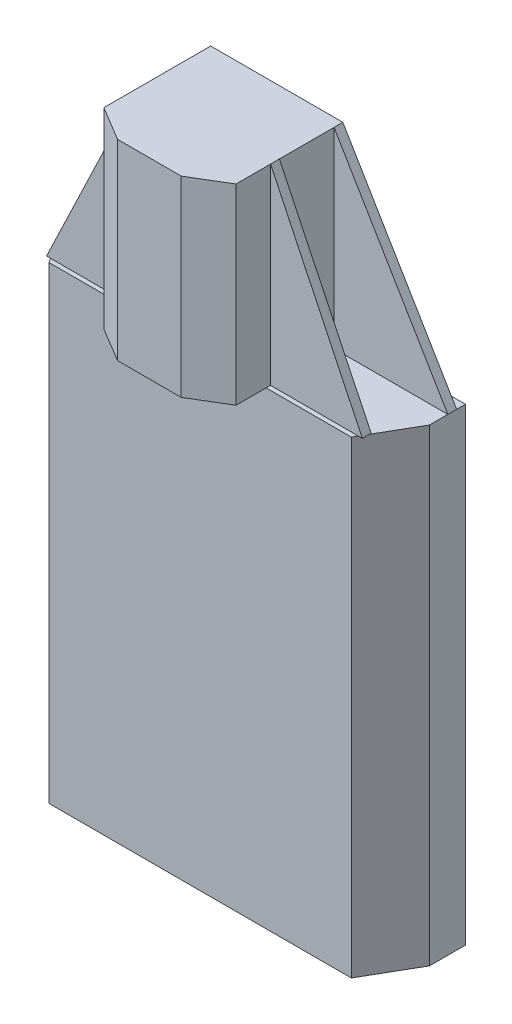
ISO-10303-21;
HEADER;
FILE_DESCRIPTION(('STEP AP214'),'2;1');
FILE_NAME('part.step','',(''),(''),'','','');
FILE_SCHEMA(('AUTOMOTIVE_DESIGN { 1 0 10303 214 1 1 1 1 }'));
ENDSEC;
DATA;
#1=APPLICATION_CONTEXT('core data for automotive mechanical design processes');
#2=APPLICATION_PROTOCOL_DEFINITION('international standard','automotive_design',2000,#1);
#3=PRODUCT_CONTEXT('',#1,'mechanical');
#4=PRODUCT('Part','Part','',(#3));
#5=PRODUCT_RELATED_PRODUCT_CATEGORY('part','',(#4));
#6=PRODUCT_DEFINITION_FORMATION('','',#4);
#7=PRODUCT_DEFINITION_CONTEXT('part definition',#1,'design');
#8=PRODUCT_DEFINITION('design','',#6,#7);
#9=PRODUCT_DEFINITION_SHAPE('','',#8);
#10=(LENGTH_UNIT() NAMED_UNIT(*) SI_UNIT(.MILLI.,.METRE.));
#11=(NAMED_UNIT(*) PLANE_ANGLE_UNIT() SI_UNIT($,.RADIAN.));
#12=(NAMED_UNIT(*) SI_UNIT($,.STERADIAN.) SOLID_ANGLE_UNIT());
#13=UNCERTAINTY_MEASURE_WITH_UNIT(LENGTH_MEASURE(1.E-05),#10,'distance_accuracy_value','');
#14=(GEOMETRIC_REPRESENTATION_CONTEXT(3) GLOBAL_UNCERTAINTY_ASSIGNED_CONTEXT((#13)) GLOBAL_UNIT_ASSIGNED_CONTEXT((#10,
#11,#12)) REPRESENTATION_CONTEXT('',''));
#15=CARTESIAN_POINT('',(0.,0.,0.));
#16=DIRECTION('',(0.,0.,1.));
#17=DIRECTION('',(1.,0.,0.));
#18=AXIS2_PLACEMENT_3D('',#15,#16,#17);
#19=CARTESIAN_POINT('',(-50.,-54.,1277.));
#20=DIRECTION('',(0.,-1.,0.));
#21=DIRECTION('',(1.,0.,0.));
#22=AXIS2_PLACEMENT_3D('',#19,#20,#21);
#23=PLANE('',#22);
#24=DIRECTION('',(0.,0.,1.));
#25=VECTOR('',#24,1.);
#26=CARTESIAN_POINT('',(195.,-54.,1277.));
#27=LINE('',#26,#25);
#28=CARTESIAN_POINT('',(195.,-54.,1277.));
#29=VERTEX_POINT('',#28);
#30=CARTESIAN_POINT('',(195.,-54.,1326.));
#31=VERTEX_POINT('',#30);
#32=EDGE_CURVE('E11',#29,#31,#27,.T.);
#33=ORIENTED_EDGE('',*,*,#32,.T.);
#34=DIRECTION('',(-0.500000000000017,0.,0.866025403784429));
#35=VECTOR('',#34,1.);
#36=CARTESIAN_POINT('',(195.,-54.,1326.));
#37=LINE('',#36,#35);
#38=CARTESIAN_POINT('',(156.0288568297,-54.,1393.5));
#39=VERTEX_POINT('',#38);
#40=EDGE_CURVE('E27',#31,#39,#37,.T.);
#41=ORIENTED_EDGE('',*,*,#40,.T.);
#42=DIRECTION('',(-1.,0.,0.));
#43=VECTOR('',#42,1.);
#44=CARTESIAN_POINT('',(156.0288568297,-54.,1393.5));
#45=LINE('',#44,#43);
#46=CARTESIAN_POINT('',(-256.0288568297,-54.,1393.5));
#47=VERTEX_POINT('',#46);
#48=EDGE_CURVE('E347',#39,#47,#45,.T.);
#49=ORIENTED_EDGE('',*,*,#48,.T.);
#50=DIRECTION('',(-0.500000000000017,0.,-0.866025403784429));
#51=VECTOR('',#50,1.);
#52=CARTESIAN_POINT('',(-256.0288568297,-54.,1393.5));
#53=LINE('',#52,#51);
#54=CARTESIAN_POINT('',(-295.,-54.,1326.));
#55=VERTEX_POINT('',#54);
#56=EDGE_CURVE('E362',#47,#55,#53,.T.);
#57=ORIENTED_EDGE('',*,*,#56,.T.);
#58=DIRECTION('',(0.,0.,-1.));
#59=VECTOR('',#58,1.);
#60=CARTESIAN_POINT('',(-295.,-54.,1326.));
#61=LINE('',#60,#59);
#62=CARTESIAN_POINT('',(-295.,-54.,1277.));
#63=VERTEX_POINT('',#62);
#64=EDGE_CURVE('E369',#55,#63,#61,.T.);
#65=ORIENTED_EDGE('',*,*,#64,.T.);
#66=DIRECTION('',(1.,0.,0.));
#67=VECTOR('',#66,1.);
#68=CARTESIAN_POINT('',(-295.,-54.,1277.));
#69=LINE('',#68,#67);
#70=EDGE_CURVE('E285',#63,#29,#69,.T.);
#71=ORIENTED_EDGE('',*,*,#70,.T.);
#72=EDGE_LOOP('',(#33,#41,#49,#57,#65,#71));
#73=FACE_BOUND('',#72,.T.);
#74=ADVANCED_FACE('F17',(#73),#23,.T.);
#75=CARTESIAN_POINT('',(-295.,-54.,1277.));
#76=DIRECTION('',(0.,0.,-1.));
#77=DIRECTION('',(0.,1.,0.));
#78=AXIS2_PLACEMENT_3D('',#75,#76,#77);
#79=PLANE('',#78);
#80=DIRECTION('',(0.,1.,0.));
#81=VECTOR('',#80,1.);
#82=CARTESIAN_POINT('',(-295.,-54.,1277.));
#83=LINE('',#82,#81);
#84=CARTESIAN_POINT('',(-295.,584.,1277.));
#85=VERTEX_POINT('',#84);
#86=EDGE_CURVE('E175',#63,#85,#83,.T.);
#87=ORIENTED_EDGE('',*,*,#86,.T.);
#88=DIRECTION('',(1.,0.,0.));
#89=VECTOR('',#88,1.);
#90=CARTESIAN_POINT('',(-295.,584.,1277.));
#91=LINE('',#90,#89);
#92=CARTESIAN_POINT('',(195.,584.,1277.));
#93=VERTEX_POINT('',#92);
#94=EDGE_CURVE('E172',#85,#93,#91,.T.);
#95=ORIENTED_EDGE('',*,*,#94,.T.);
#96=DIRECTION('',(0.,1.,0.));
#97=VECTOR('',#96,1.);
#98=CARTESIAN_POINT('',(195.,-54.,1277.));
#99=LINE('',#98,#97);
#100=EDGE_CURVE('E160',#29,#93,#99,.T.);
#101=ORIENTED_EDGE('',*,*,#100,.F.);
#102=ORIENTED_EDGE('',*,*,#70,.F.);
#103=EDGE_LOOP('',(#87,#95,#101,#102));
#104=FACE_BOUND('',#103,.T.);
#105=ADVANCED_FACE('F173',(#104),#79,.T.);
#106=CARTESIAN_POINT('',(195.,-54.,1277.));
#107=DIRECTION('',(1.,0.,0.));
#108=DIRECTION('',(0.,0.,1.));
#109=AXIS2_PLACEMENT_3D('',#106,#107,#108);
#110=PLANE('',#109);
#111=DIRECTION('',(0.,0.,1.));
#112=VECTOR('',#111,1.);
#113=CARTESIAN_POINT('',(195.,584.,1301.));
#114=LINE('',#113,#112);
#115=CARTESIAN_POINT('',(195.,584.,1301.));
#116=VERTEX_POINT('',#115);
#117=CARTESIAN_POINT('',(195.,584.,1326.));
#118=VERTEX_POINT('',#117);
#119=EDGE_CURVE('E169',#116,#118,#114,.T.);
#120=ORIENTED_EDGE('',*,*,#119,.T.);
#121=DIRECTION('',(0.,1.,0.));
#122=VECTOR('',#121,1.);
#123=CARTESIAN_POINT('',(195.,-54.,1326.));
#124=LINE('',#123,#122);
#125=EDGE_CURVE('E202',#31,#118,#124,.T.);
#126=ORIENTED_EDGE('',*,*,#125,.F.);
#127=ORIENTED_EDGE('',*,*,#32,.F.);
#128=ORIENTED_EDGE('',*,*,#100,.T.);
#129=DIRECTION('',(0.,0.,1.));
#130=VECTOR('',#129,1.);
#131=CARTESIAN_POINT('',(195.,584.,1277.));
#132=LINE('',#131,#130);
#133=CARTESIAN_POINT('',(195.,584.,1289.));
#134=VERTEX_POINT('',#133);
#135=EDGE_CURVE('E165',#93,#134,#132,.T.);
#136=ORIENTED_EDGE('',*,*,#135,.T.);
#137=DIRECTION('',(0.,0.,-1.));
#138=VECTOR('',#137,1.);
#139=CARTESIAN_POINT('',(195.,584.,1301.));
#140=LINE('',#139,#138);
#141=EDGE_CURVE('E230',#116,#134,#140,.T.);
#142=ORIENTED_EDGE('',*,*,#141,.F.);
#143=EDGE_LOOP('',(#120,#126,#127,#128,#136,#142));
#144=FACE_BOUND('',#143,.T.);
#145=ADVANCED_FACE('F163',(#144),#110,.T.);
#146=CARTESIAN_POINT('',(40.,845.,1289.));
#147=DIRECTION('',(0.859809548053483,0.51061486570219,0.));
#148=DIRECTION('',(0.,0.,-1.));
#149=AXIS2_PLACEMENT_3D('',#146,#147,#148);
#150=PLANE('',#149);
#151=DIRECTION('',(0.51061486570219,-0.859809548053483,0.));
#152=VECTOR('',#151,1.);
#153=CARTESIAN_POINT('',(40.,845.,1289.));
#154=LINE('',#153,#152);
#155=CARTESIAN_POINT('',(40.,845.,1289.));
#156=VERTEX_POINT('',#155);
#157=EDGE_CURVE('E307',#156,#134,#154,.T.);
#158=ORIENTED_EDGE('',*,*,#157,.F.);
#159=DIRECTION('',(0.,0.,1.));
#160=VECTOR('',#159,1.);
#161=CARTESIAN_POINT('',(40.,845.,1289.));
#162=LINE('',#161,#160);
#163=CARTESIAN_POINT('',(40.,845.,1301.));
#164=VERTEX_POINT('',#163);
#165=EDGE_CURVE('E182',#156,#164,#162,.T.);
#166=ORIENTED_EDGE('',*,*,#165,.T.);
#167=DIRECTION('',(0.51061486570219,-0.859809548053483,0.));
#168=VECTOR('',#167,1.);
#169=CARTESIAN_POINT('',(40.,845.,1301.));
#170=LINE('',#169,#168);
#171=EDGE_CURVE('E185',#164,#116,#170,.T.);
#172=ORIENTED_EDGE('',*,*,#171,.T.);
#173=ORIENTED_EDGE('',*,*,#141,.T.);
#174=EDGE_LOOP('',(#158,#166,#172,#173));
#175=FACE_BOUND('',#174,.T.);
#176=ADVANCED_FACE('F721',(#175),#150,.T.);
#177=CARTESIAN_POINT('',(-50.,584.,1301.));
#178=DIRECTION('',(0.,0.,-1.));
#179=DIRECTION('',(0.,1.,0.));
#180=AXIS2_PLACEMENT_3D('',#177,#178,#179);
#181=PLANE('',#180);
#182=DIRECTION('',(0.,1.,0.));
#183=VECTOR('',#182,1.);
#184=CARTESIAN_POINT('',(-140.,584.,1301.));
#185=LINE('',#184,#183);
#186=CARTESIAN_POINT('',(-140.,584.,1301.));
#187=VERTEX_POINT('',#186);
#188=CARTESIAN_POINT('',(-140.,845.,1301.));
#189=VERTEX_POINT('',#188);
#190=EDGE_CURVE('E316',#187,#189,#185,.T.);
#191=ORIENTED_EDGE('',*,*,#190,.T.);
#192=DIRECTION('',(0.51061486570219,0.859809548053483,0.));
#193=VECTOR('',#192,1.);
#194=CARTESIAN_POINT('',(-295.,584.,1301.));
#195=LINE('',#194,#193);
#196=CARTESIAN_POINT('',(-295.,584.,1301.));
#197=VERTEX_POINT('',#196);
#198=EDGE_CURVE('E320',#197,#189,#195,.T.);
#199=ORIENTED_EDGE('',*,*,#198,.F.);
#200=DIRECTION('',(1.,0.,0.));
#201=VECTOR('',#200,1.);
#202=CARTESIAN_POINT('',(-295.,584.,1301.));
#203=LINE('',#202,#201);
#204=EDGE_CURVE('E313',#197,#187,#203,.T.);
#205=ORIENTED_EDGE('',*,*,#204,.T.);
#206=EDGE_LOOP('',(#191,#199,#205));
#207=FACE_BOUND('',#206,.T.);
#208=ADVANCED_FACE('F397',(#207),#181,.F.);
#209=CARTESIAN_POINT('',(-50.,584.,1301.));
#210=DIRECTION('',(0.,0.,-1.));
#211=DIRECTION('',(0.,1.,0.));
#212=AXIS2_PLACEMENT_3D('',#209,#210,#211);
#213=PLANE('',#212);
#214=ORIENTED_EDGE('',*,*,#171,.F.);
#215=DIRECTION('',(0.,1.,0.));
#216=VECTOR('',#215,1.);
#217=CARTESIAN_POINT('',(40.,584.,1301.));
#218=LINE('',#217,#216);
#219=CARTESIAN_POINT('',(40.,584.,1301.));
#220=VERTEX_POINT('',#219);
#221=EDGE_CURVE('E245',#220,#164,#218,.T.);
#222=ORIENTED_EDGE('',*,*,#221,.F.);
#223=DIRECTION('',(1.,0.,0.));
#224=VECTOR('',#223,1.);
#225=CARTESIAN_POINT('',(40.,584.,1301.));
#226=LINE('',#225,#224);
#227=EDGE_CURVE('E317',#220,#116,#226,.T.);
#228=ORIENTED_EDGE('',*,*,#227,.T.);
#229=EDGE_LOOP('',(#214,#222,#228));
#230=FACE_BOUND('',#229,.T.);
#231=ADVANCED_FACE('F498',(#230),#213,.F.);
#232=CARTESIAN_POINT('',(-50.,584.,1277.));
#233=DIRECTION('',(0.,-1.,0.));
#234=DIRECTION('',(1.,0.,0.));
#235=AXIS2_PLACEMENT_3D('',#232,#233,#234);
#236=PLANE('',#235);
#237=ORIENTED_EDGE('',*,*,#135,.F.);
#238=ORIENTED_EDGE('',*,*,#94,.F.);
#239=DIRECTION('',(0.,0.,-1.));
#240=VECTOR('',#239,1.);
#241=CARTESIAN_POINT('',(-295.,584.,1289.));
#242=LINE('',#241,#240);
#243=CARTESIAN_POINT('',(-295.,584.,1289.));
#244=VERTEX_POINT('',#243);
#245=EDGE_CURVE('E240',#244,#85,#242,.T.);
#246=ORIENTED_EDGE('',*,*,#245,.F.);
#247=DIRECTION('',(1.,0.,0.));
#248=VECTOR('',#247,1.);
#249=CARTESIAN_POINT('',(-295.,584.,1289.));
#250=LINE('',#249,#248);
#251=EDGE_CURVE('E181',#244,#134,#250,.T.);
#252=ORIENTED_EDGE('',*,*,#251,.T.);
#253=EDGE_LOOP('',(#237,#238,#246,#252));
#254=FACE_BOUND('',#253,.T.);
#255=ADVANCED_FACE('F179',(#254),#236,.F.);
#256=CARTESIAN_POINT('',(-50.,584.,1277.));
#257=DIRECTION('',(0.,-1.,0.));
#258=DIRECTION('',(1.,0.,0.));
#259=AXIS2_PLACEMENT_3D('',#256,#257,#258);
#260=PLANE('',#259);
#261=DIRECTION('',(0.,0.,-1.));
#262=VECTOR('',#261,1.);
#263=CARTESIAN_POINT('',(-140.,584.,1375.5));
#264=LINE('',#263,#262);
#265=CARTESIAN_POINT('',(-140.,584.,1375.5));
#266=VERTEX_POINT('',#265);
#267=EDGE_CURVE('E250',#266,#187,#264,.T.);
#268=ORIENTED_EDGE('',*,*,#267,.T.);
#269=ORIENTED_EDGE('',*,*,#204,.F.);
#270=DIRECTION('',(0.,0.,-1.));
#271=VECTOR('',#270,1.);
#272=CARTESIAN_POINT('',(-295.,584.,1326.));
#273=LINE('',#272,#271);
#274=CARTESIAN_POINT('',(-295.,584.,1326.));
#275=VERTEX_POINT('',#274);
#276=EDGE_CURVE('E208',#275,#197,#273,.T.);
#277=ORIENTED_EDGE('',*,*,#276,.F.);
#278=DIRECTION('',(-0.500000000000017,0.,-0.866025403784429));
#279=VECTOR('',#278,1.);
#280=CARTESIAN_POINT('',(-265.05,584.,1377.8749216867));
#281=LINE('',#280,#279);
#282=CARTESIAN_POINT('',(-265.05,584.,1377.8749216867));
#283=VERTEX_POINT('',#282);
#284=EDGE_CURVE('E231',#283,#275,#281,.T.);
#285=ORIENTED_EDGE('',*,*,#284,.F.);
#286=DIRECTION('',(0.,0.,1.));
#287=VECTOR('',#286,1.);
#288=CARTESIAN_POINT('',(-265.05,584.,1375.5));
#289=LINE('',#288,#287);
#290=CARTESIAN_POINT('',(-265.05,584.,1375.5));
#291=VERTEX_POINT('',#290);
#292=EDGE_CURVE('E278',#291,#283,#289,.T.);
#293=ORIENTED_EDGE('',*,*,#292,.F.);
#294=DIRECTION('',(1.,0.,0.));
#295=VECTOR('',#294,1.);
#296=CARTESIAN_POINT('',(-265.05,584.,1375.5));
#297=LINE('',#296,#295);
#298=EDGE_CURVE('E253',#291,#266,#297,.T.);
#299=ORIENTED_EDGE('',*,*,#298,.T.);
#300=EDGE_LOOP('',(#268,#269,#277,#285,#293,#299));
#301=FACE_BOUND('',#300,.T.);
#302=ADVANCED_FACE('F386',(#301),#260,.F.);
#303=CARTESIAN_POINT('',(-50.,584.,1277.));
#304=DIRECTION('',(0.,-1.,0.));
#305=DIRECTION('',(1.,0.,0.));
#306=AXIS2_PLACEMENT_3D('',#303,#304,#305);
#307=PLANE('',#306);
#308=DIRECTION('',(0.,0.,1.));
#309=VECTOR('',#308,1.);
#310=CARTESIAN_POINT('',(165.05,584.,1375.5));
#311=LINE('',#310,#309);
#312=CARTESIAN_POINT('',(165.05,584.,1375.5));
#313=VERTEX_POINT('',#312);
#314=CARTESIAN_POINT('',(165.05,584.,1377.8749216867));
#315=VERTEX_POINT('',#314);
#316=EDGE_CURVE('E254',#313,#315,#311,.T.);
#317=ORIENTED_EDGE('',*,*,#316,.T.);
#318=DIRECTION('',(-0.500000000000017,0.,0.866025403784429));
#319=VECTOR('',#318,1.);
#320=CARTESIAN_POINT('',(195.,584.,1326.));
#321=LINE('',#320,#319);
#322=EDGE_CURVE('E199',#118,#315,#321,.T.);
#323=ORIENTED_EDGE('',*,*,#322,.F.);
#324=ORIENTED_EDGE('',*,*,#119,.F.);
#325=ORIENTED_EDGE('',*,*,#227,.F.);
#326=DIRECTION('',(0.,0.,-1.));
#327=VECTOR('',#326,1.);
#328=CARTESIAN_POINT('',(40.,584.,1375.5));
#329=LINE('',#328,#327);
#330=CARTESIAN_POINT('',(40.,584.,1375.5));
#331=VERTEX_POINT('',#330);
#332=EDGE_CURVE('E248',#331,#220,#329,.T.);
#333=ORIENTED_EDGE('',*,*,#332,.F.);
#334=DIRECTION('',(1.,0.,0.));
#335=VECTOR('',#334,1.);
#336=CARTESIAN_POINT('',(40.,584.,1375.5));
#337=LINE('',#336,#335);
#338=EDGE_CURVE('E257',#331,#313,#337,.T.);
#339=ORIENTED_EDGE('',*,*,#338,.T.);
#340=EDGE_LOOP('',(#317,#323,#324,#325,#333,#339));
#341=FACE_BOUND('',#340,.T.);
#342=ADVANCED_FACE('F508',(#341),#307,.F.);
#343=CARTESIAN_POINT('',(-50.,584.,1277.));
#344=DIRECTION('',(0.,-1.,0.));
#345=DIRECTION('',(1.,0.,0.));
#346=AXIS2_PLACEMENT_3D('',#343,#344,#345);
#347=PLANE('',#346);
#348=DIRECTION('',(-0.500000000000017,0.,-0.866025403784429));
#349=VECTOR('',#348,1.);
#350=CARTESIAN_POINT('',(-256.0288568297,584.,1393.5));
#351=LINE('',#350,#349);
#352=CARTESIAN_POINT('',(-256.0288568297,584.,1393.5));
#353=VERTEX_POINT('',#352);
#354=CARTESIAN_POINT('',(-259.4929584448,584.,1387.5));
#355=VERTEX_POINT('',#354);
#356=EDGE_CURVE('E282',#353,#355,#351,.T.);
#357=ORIENTED_EDGE('',*,*,#356,.F.);
#358=DIRECTION('',(-1.,0.,0.));
#359=VECTOR('',#358,1.);
#360=CARTESIAN_POINT('',(-140.,584.,1393.5));
#361=LINE('',#360,#359);
#362=CARTESIAN_POINT('',(-140.,584.,1393.5));
#363=VERTEX_POINT('',#362);
#364=EDGE_CURVE('E200',#363,#353,#361,.T.);
#365=ORIENTED_EDGE('',*,*,#364,.F.);
#366=DIRECTION('',(0.,0.,-1.));
#367=VECTOR('',#366,1.);
#368=CARTESIAN_POINT('',(-140.,584.,1393.5));
#369=LINE('',#368,#367);
#370=CARTESIAN_POINT('',(-140.,584.,1387.5));
#371=VERTEX_POINT('',#370);
#372=EDGE_CURVE('E294',#363,#371,#369,.T.);
#373=ORIENTED_EDGE('',*,*,#372,.T.);
#374=DIRECTION('',(1.,0.,0.));
#375=VECTOR('',#374,1.);
#376=CARTESIAN_POINT('',(-259.4929584448,584.,1387.5));
#377=LINE('',#376,#375);
#378=EDGE_CURVE('E268',#355,#371,#377,.T.);
#379=ORIENTED_EDGE('',*,*,#378,.F.);
#380=EDGE_LOOP('',(#357,#365,#373,#379));
#381=FACE_BOUND('',#380,.T.);
#382=ADVANCED_FACE('F422',(#381),#347,.F.);
#383=CARTESIAN_POINT('',(-50.,584.,1277.));
#384=DIRECTION('',(0.,-1.,0.));
#385=DIRECTION('',(1.,0.,0.));
#386=AXIS2_PLACEMENT_3D('',#383,#384,#385);
#387=PLANE('',#386);
#388=DIRECTION('',(0.,0.,-1.));
#389=VECTOR('',#388,1.);
#390=CARTESIAN_POINT('',(40.,584.,1393.5));
#391=LINE('',#390,#389);
#392=CARTESIAN_POINT('',(40.,584.,1393.5));
#393=VERTEX_POINT('',#392);
#394=CARTESIAN_POINT('',(40.,584.,1387.5));
#395=VERTEX_POINT('',#394);
#396=EDGE_CURVE('E289',#393,#395,#391,.T.);
#397=ORIENTED_EDGE('',*,*,#396,.F.);
#398=DIRECTION('',(-1.,0.,0.));
#399=VECTOR('',#398,1.);
#400=CARTESIAN_POINT('',(156.0288568297,584.,1393.5));
#401=LINE('',#400,#399);
#402=CARTESIAN_POINT('',(156.0288568297,584.,1393.5));
#403=VERTEX_POINT('',#402);
#404=EDGE_CURVE('E191',#403,#393,#401,.T.);
#405=ORIENTED_EDGE('',*,*,#404,.F.);
#406=DIRECTION('',(-0.500000000000017,0.,0.866025403784429));
#407=VECTOR('',#406,1.);
#408=CARTESIAN_POINT('',(159.4929584448,584.,1387.5));
#409=LINE('',#408,#407);
#410=CARTESIAN_POINT('',(159.4929584448,584.,1387.5));
#411=VERTEX_POINT('',#410);
#412=EDGE_CURVE('E222',#411,#403,#409,.T.);
#413=ORIENTED_EDGE('',*,*,#412,.F.);
#414=DIRECTION('',(1.,0.,0.));
#415=VECTOR('',#414,1.);
#416=CARTESIAN_POINT('',(40.,584.,1387.5));
#417=LINE('',#416,#415);
#418=EDGE_CURVE('E235',#395,#411,#417,.T.);
#419=ORIENTED_EDGE('',*,*,#418,.F.);
#420=EDGE_LOOP('',(#397,#405,#413,#419));
#421=FACE_BOUND('',#420,.T.);
#422=ADVANCED_FACE('F507',(#421),#387,.F.);
#423=CARTESIAN_POINT('',(40.,584.,1289.));
#424=DIRECTION('',(0.,0.,-1.));
#425=DIRECTION('',(0.,1.,0.));
#426=AXIS2_PLACEMENT_3D('',#423,#424,#425);
#427=PLANE('',#426);
#428=DIRECTION('',(0.51061486570219,0.859809548053483,0.));
#429=VECTOR('',#428,1.);
#430=CARTESIAN_POINT('',(-295.,584.,1289.));
#431=LINE('',#430,#429);
#432=CARTESIAN_POINT('',(-140.,845.,1289.));
#433=VERTEX_POINT('',#432);
#434=EDGE_CURVE('E299',#244,#433,#431,.T.);
#435=ORIENTED_EDGE('',*,*,#434,.T.);
#436=DIRECTION('',(-1.,0.,0.));
#437=VECTOR('',#436,1.);
#438=CARTESIAN_POINT('',(40.,845.,1289.));
#439=LINE('',#438,#437);
#440=EDGE_CURVE('E203',#156,#433,#439,.T.);
#441=ORIENTED_EDGE('',*,*,#440,.F.);
#442=ORIENTED_EDGE('',*,*,#157,.T.);
#443=ORIENTED_EDGE('',*,*,#251,.F.);
#444=EDGE_LOOP('',(#435,#441,#442,#443));
#445=FACE_BOUND('',#444,.T.);
#446=ADVANCED_FACE('F526',(#445),#427,.T.);
#447=CARTESIAN_POINT('',(-50.,845.,1277.));
#448=DIRECTION('',(0.,1.,0.));
#449=DIRECTION('',(0.,0.,-1.));
#450=AXIS2_PLACEMENT_3D('',#447,#448,#449);
#451=PLANE('',#450);
#452=DIRECTION('',(0.,0.,-1.));
#453=VECTOR('',#452,1.);
#454=CARTESIAN_POINT('',(40.,845.,1375.5));
#455=LINE('',#454,#453);
#456=CARTESIAN_POINT('',(40.,845.,1375.5));
#457=VERTEX_POINT('',#456);
#458=EDGE_CURVE('E206',#457,#164,#455,.T.);
#459=ORIENTED_EDGE('',*,*,#458,.T.);
#460=ORIENTED_EDGE('',*,*,#165,.F.);
#461=ORIENTED_EDGE('',*,*,#440,.T.);
#462=DIRECTION('',(0.,0.,1.));
#463=VECTOR('',#462,1.);
#464=CARTESIAN_POINT('',(-140.,845.,1289.));
#465=LINE('',#464,#463);
#466=EDGE_CURVE('E207',#433,#189,#465,.T.);
#467=ORIENTED_EDGE('',*,*,#466,.T.);
#468=DIRECTION('',(0.,0.,1.));
#469=VECTOR('',#468,1.);
#470=CARTESIAN_POINT('',(-140.,845.,1301.));
#471=LINE('',#470,#469);
#472=CARTESIAN_POINT('',(-140.,845.,1375.5));
#473=VERTEX_POINT('',#472);
#474=EDGE_CURVE('E216',#189,#473,#471,.T.);
#475=ORIENTED_EDGE('',*,*,#474,.T.);
#476=DIRECTION('',(0.,0.,1.));
#477=VECTOR('',#476,1.);
#478=CARTESIAN_POINT('',(-140.,845.,1375.5));
#479=LINE('',#478,#477);
#480=CARTESIAN_POINT('',(-140.,845.,1387.5));
#481=VERTEX_POINT('',#480);
#482=EDGE_CURVE('E213',#473,#481,#479,.T.);
#483=ORIENTED_EDGE('',*,*,#482,.T.);
#484=DIRECTION('',(0.,0.,1.));
#485=VECTOR('',#484,1.);
#486=CARTESIAN_POINT('',(-140.,845.,1387.5));
#487=LINE('',#486,#485);
#488=CARTESIAN_POINT('',(-140.,845.,1434.5));
#489=VERTEX_POINT('',#488);
#490=EDGE_CURVE('E217',#481,#489,#487,.T.);
#491=ORIENTED_EDGE('',*,*,#490,.T.);
#492=DIRECTION('',(0.857411828262364,0.,0.514630893705178));
#493=VECTOR('',#492,1.);
#494=CARTESIAN_POINT('',(-140.,845.,1434.5));
#495=LINE('',#494,#493);
#496=CARTESIAN_POINT('',(-93.35,845.,1462.5));
#497=VERTEX_POINT('',#496);
#498=EDGE_CURVE('E76',#489,#497,#495,.T.);
#499=ORIENTED_EDGE('',*,*,#498,.T.);
#500=DIRECTION('',(1.,0.,0.));
#501=VECTOR('',#500,1.);
#502=CARTESIAN_POINT('',(-93.35,845.,1462.5));
#503=LINE('',#502,#501);
#504=CARTESIAN_POINT('',(-6.65,845.,1462.5));
#505=VERTEX_POINT('',#504);
#506=EDGE_CURVE('E68',#497,#505,#503,.T.);
#507=ORIENTED_EDGE('',*,*,#506,.T.);
#508=DIRECTION('',(0.857411828262364,0.,-0.514630893705178));
#509=VECTOR('',#508,1.);
#510=CARTESIAN_POINT('',(-6.65,845.,1462.5));
#511=LINE('',#510,#509);
#512=CARTESIAN_POINT('',(40.,845.,1434.5));
#513=VERTEX_POINT('',#512);
#514=EDGE_CURVE('E261',#505,#513,#511,.T.);
#515=ORIENTED_EDGE('',*,*,#514,.T.);
#516=DIRECTION('',(0.,0.,-1.));
#517=VECTOR('',#516,1.);
#518=CARTESIAN_POINT('',(40.,845.,1434.5));
#519=LINE('',#518,#517);
#520=CARTESIAN_POINT('',(40.,845.,1387.5));
#521=VERTEX_POINT('',#520);
#522=EDGE_CURVE('E264',#513,#521,#519,.T.);
#523=ORIENTED_EDGE('',*,*,#522,.T.);
#524=DIRECTION('',(0.,0.,1.));
#525=VECTOR('',#524,1.);
#526=CARTESIAN_POINT('',(40.,845.,1375.5));
#527=LINE('',#526,#525);
#528=EDGE_CURVE('E221',#457,#521,#527,.T.);
#529=ORIENTED_EDGE('',*,*,#528,.F.);
#530=EDGE_LOOP('',(#459,#460,#461,#467,#475,#483,#491,#499,#507,#515,#523,#529));
#531=FACE_BOUND('',#530,.T.);
#532=ADVANCED_FACE('F451',(#531),#451,.T.);
#533=CARTESIAN_POINT('',(165.05,584.,1375.5));
#534=DIRECTION('',(0.901832859355996,0.432085053879198,0.));
#535=DIRECTION('',(0.,0.,-1.));
#536=AXIS2_PLACEMENT_3D('',#533,#534,#535);
#537=PLANE('',#536);
#538=DIRECTION('',(-0.432085053879198,0.901832859355995,0.));
#539=VECTOR('',#538,1.);
#540=CARTESIAN_POINT('',(165.05,584.,1375.5));
#541=LINE('',#540,#539);
#542=EDGE_CURVE('E21',#313,#457,#541,.T.);
#543=ORIENTED_EDGE('',*,*,#542,.T.);
#544=ORIENTED_EDGE('',*,*,#528,.T.);
#545=DIRECTION('',(-0.432085053879198,0.901832859355995,0.));
#546=VECTOR('',#545,1.);
#547=CARTESIAN_POINT('',(165.05,584.,1387.5));
#548=LINE('',#547,#546);
#549=CARTESIAN_POINT('',(165.05,584.,1387.5));
#550=VERTEX_POINT('',#549);
#551=EDGE_CURVE('E237',#550,#521,#548,.T.);
#552=ORIENTED_EDGE('',*,*,#551,.F.);
#553=DIRECTION('',(0.,0.,1.));
#554=VECTOR('',#553,1.);
#555=CARTESIAN_POINT('',(165.05,584.,1377.8749216867));
#556=LINE('',#555,#554);
#557=EDGE_CURVE('E218',#315,#550,#556,.T.);
#558=ORIENTED_EDGE('',*,*,#557,.F.);
#559=ORIENTED_EDGE('',*,*,#316,.F.);
#560=EDGE_LOOP('',(#543,#544,#552,#558,#559));
#561=FACE_BOUND('',#560,.T.);
#562=ADVANCED_FACE('F465',(#561),#537,.T.);
#563=CARTESIAN_POINT('',(40.,584.,1375.5));
#564=DIRECTION('',(0.,-1.,0.));
#565=DIRECTION('',(1.,0.,0.));
#566=AXIS2_PLACEMENT_3D('',#563,#564,#565);
#567=PLANE('',#566);
#568=ORIENTED_EDGE('',*,*,#557,.T.);
#569=DIRECTION('',(1.,0.,0.));
#570=VECTOR('',#569,1.);
#571=CARTESIAN_POINT('',(159.4929584448,584.,1387.5));
#572=LINE('',#571,#570);
#573=EDGE_CURVE('E272',#411,#550,#572,.T.);
#574=ORIENTED_EDGE('',*,*,#573,.F.);
#575=DIRECTION('',(-0.500000000000017,0.,0.866025403784429));
#576=VECTOR('',#575,1.);
#577=CARTESIAN_POINT('',(165.05,584.,1377.8749216867));
#578=LINE('',#577,#576);
#579=EDGE_CURVE('E196',#315,#411,#578,.T.);
#580=ORIENTED_EDGE('',*,*,#579,.F.);
#581=EDGE_LOOP('',(#568,#574,#580));
#582=FACE_BOUND('',#581,.T.);
#583=ADVANCED_FACE('F495',(#582),#567,.T.);
#584=CARTESIAN_POINT('',(195.,-54.,1326.));
#585=DIRECTION('',(0.866025403784429,0.,0.500000000000017));
#586=DIRECTION('',(0.,1.,0.));
#587=AXIS2_PLACEMENT_3D('',#584,#585,#586);
#588=PLANE('',#587);
#589=ORIENTED_EDGE('',*,*,#412,.T.);
#590=DIRECTION('',(0.,1.,0.));
#591=VECTOR('',#590,1.);
#592=CARTESIAN_POINT('',(156.0288568297,-54.,1393.5));
#593=LINE('',#592,#591);
#594=EDGE_CURVE('E194',#39,#403,#593,.T.);
#595=ORIENTED_EDGE('',*,*,#594,.F.);
#596=ORIENTED_EDGE('',*,*,#40,.F.);
#597=ORIENTED_EDGE('',*,*,#125,.T.);
#598=ORIENTED_EDGE('',*,*,#322,.T.);
#599=ORIENTED_EDGE('',*,*,#579,.T.);
#600=EDGE_LOOP('',(#589,#595,#596,#597,#598,#599));
#601=FACE_BOUND('',#600,.T.);
#602=ADVANCED_FACE('F492',(#601),#588,.T.);
#603=CARTESIAN_POINT('',(156.0288568297,-54.,1393.5));
#604=DIRECTION('',(0.,0.,1.));
#605=DIRECTION('',(1.,0.,0.));
#606=AXIS2_PLACEMENT_3D('',#603,#604,#605);
#607=PLANE('',#606);
#608=ORIENTED_EDGE('',*,*,#364,.T.);
#609=DIRECTION('',(0.,1.,0.));
#610=VECTOR('',#609,1.);
#611=CARTESIAN_POINT('',(-256.0288568297,-54.,1393.5));
#612=LINE('',#611,#610);
#613=EDGE_CURVE('E234',#47,#353,#612,.T.);
#614=ORIENTED_EDGE('',*,*,#613,.F.);
#615=ORIENTED_EDGE('',*,*,#48,.F.);
#616=ORIENTED_EDGE('',*,*,#594,.T.);
#617=ORIENTED_EDGE('',*,*,#404,.T.);
#618=DIRECTION('',(-1.,0.,0.));
#619=VECTOR('',#618,1.);
#620=CARTESIAN_POINT('',(40.,584.,1393.5));
#621=LINE('',#620,#619);
#622=EDGE_CURVE('E195',#393,#363,#621,.T.);
#623=ORIENTED_EDGE('',*,*,#622,.T.);
#624=EDGE_LOOP('',(#608,#614,#615,#616,#617,#623));
#625=FACE_BOUND('',#624,.T.);
#626=ADVANCED_FACE('F420',(#625),#607,.T.);
#627=CARTESIAN_POINT('',(-50.,584.,1277.));
#628=DIRECTION('',(0.,1.,0.));
#629=DIRECTION('',(0.,0.,-1.));
#630=AXIS2_PLACEMENT_3D('',#627,#628,#629);
#631=PLANE('',#630);
#632=DIRECTION('',(0.,0.,-1.));
#633=VECTOR('',#632,1.);
#634=CARTESIAN_POINT('',(40.,584.,1434.5));
#635=LINE('',#634,#633);
#636=CARTESIAN_POINT('',(40.,584.,1434.5));
#637=VERTEX_POINT('',#636);
#638=EDGE_CURVE('E249',#637,#393,#635,.T.);
#639=ORIENTED_EDGE('',*,*,#638,.F.);
#640=DIRECTION('',(0.857411828262364,0.,-0.514630893705178));
#641=VECTOR('',#640,1.);
#642=CARTESIAN_POINT('',(-6.65,584.,1462.5));
#643=LINE('',#642,#641);
#644=CARTESIAN_POINT('',(-6.65,584.,1462.5));
#645=VERTEX_POINT('',#644);
#646=EDGE_CURVE('E292',#645,#637,#643,.T.);
#647=ORIENTED_EDGE('',*,*,#646,.F.);
#648=DIRECTION('',(1.,0.,0.));
#649=VECTOR('',#648,1.);
#650=CARTESIAN_POINT('',(-93.35,584.,1462.5));
#651=LINE('',#650,#649);
#652=CARTESIAN_POINT('',(-93.35,584.,1462.5));
#653=VERTEX_POINT('',#652);
#654=EDGE_CURVE('E265',#653,#645,#651,.T.);
#655=ORIENTED_EDGE('',*,*,#654,.F.);
#656=DIRECTION('',(0.857411828262364,0.,0.514630893705178));
#657=VECTOR('',#656,1.);
#658=CARTESIAN_POINT('',(-140.,584.,1434.5));
#659=LINE('',#658,#657);
#660=CARTESIAN_POINT('',(-140.,584.,1434.5));
#661=VERTEX_POINT('',#660);
#662=EDGE_CURVE('E241',#661,#653,#659,.T.);
#663=ORIENTED_EDGE('',*,*,#662,.F.);
#664=DIRECTION('',(0.,0.,1.));
#665=VECTOR('',#664,1.);
#666=CARTESIAN_POINT('',(-140.,584.,1393.5));
#667=LINE('',#666,#665);
#668=EDGE_CURVE('E226',#363,#661,#667,.T.);
#669=ORIENTED_EDGE('',*,*,#668,.F.);
#670=ORIENTED_EDGE('',*,*,#622,.F.);
#671=EDGE_LOOP('',(#639,#647,#655,#663,#669,#670));
#672=FACE_BOUND('',#671,.T.);
#673=ADVANCED_FACE('F429',(#672),#631,.F.);
#674=CARTESIAN_POINT('',(-140.,584.,1289.));
#675=DIRECTION('',(-1.,0.,0.));
#676=DIRECTION('',(0.,-1.,0.));
#677=AXIS2_PLACEMENT_3D('',#674,#675,#676);
#678=PLANE('',#677);
#679=ORIENTED_EDGE('',*,*,#474,.F.);
#680=ORIENTED_EDGE('',*,*,#190,.F.);
#681=ORIENTED_EDGE('',*,*,#267,.F.);
#682=DIRECTION('',(0.,1.,0.));
#683=VECTOR('',#682,1.);
#684=CARTESIAN_POINT('',(-140.,584.,1375.5));
#685=LINE('',#684,#683);
#686=EDGE_CURVE('E273',#266,#473,#685,.T.);
#687=ORIENTED_EDGE('',*,*,#686,.T.);
#688=EDGE_LOOP('',(#679,#680,#681,#687));
#689=FACE_BOUND('',#688,.T.);
#690=ADVANCED_FACE('F391',(#689),#678,.T.);
#691=CARTESIAN_POINT('',(-140.,584.,1289.));
#692=DIRECTION('',(-1.,0.,0.));
#693=DIRECTION('',(0.,-1.,0.));
#694=AXIS2_PLACEMENT_3D('',#691,#692,#693);
#695=PLANE('',#694);
#696=ORIENTED_EDGE('',*,*,#372,.F.);
#697=ORIENTED_EDGE('',*,*,#668,.T.);
#698=DIRECTION('',(0.,1.,0.));
#699=VECTOR('',#698,1.);
#700=CARTESIAN_POINT('',(-140.,584.,1434.5));
#701=LINE('',#700,#699);
#702=EDGE_CURVE('E223',#661,#489,#701,.T.);
#703=ORIENTED_EDGE('',*,*,#702,.T.);
#704=ORIENTED_EDGE('',*,*,#490,.F.);
#705=DIRECTION('',(0.,1.,0.));
#706=VECTOR('',#705,1.);
#707=CARTESIAN_POINT('',(-140.,584.,1387.5));
#708=LINE('',#707,#706);
#709=EDGE_CURVE('E277',#371,#481,#708,.T.);
#710=ORIENTED_EDGE('',*,*,#709,.F.);
#711=EDGE_LOOP('',(#696,#697,#703,#704,#710));
#712=FACE_BOUND('',#711,.T.);
#713=ADVANCED_FACE('F425',(#712),#695,.T.);
#714=CARTESIAN_POINT('',(-50.,584.,1375.5));
#715=DIRECTION('',(0.,0.,1.));
#716=DIRECTION('',(1.,0.,0.));
#717=AXIS2_PLACEMENT_3D('',#714,#715,#716);
#718=PLANE('',#717);
#719=DIRECTION('',(-0.432085053879198,-0.901832859355995,0.));
#720=VECTOR('',#719,1.);
#721=CARTESIAN_POINT('',(-140.,845.,1375.5));
#722=LINE('',#721,#720);
#723=EDGE_CURVE('E281',#473,#291,#722,.T.);
#724=ORIENTED_EDGE('',*,*,#723,.F.);
#725=ORIENTED_EDGE('',*,*,#686,.F.);
#726=ORIENTED_EDGE('',*,*,#298,.F.);
#727=EDGE_LOOP('',(#724,#725,#726));
#728=FACE_BOUND('',#727,.T.);
#729=ADVANCED_FACE('F383',(#728),#718,.F.);
#730=CARTESIAN_POINT('',(-50.,584.,1375.5));
#731=DIRECTION('',(0.,0.,1.));
#732=DIRECTION('',(1.,0.,0.));
#733=AXIS2_PLACEMENT_3D('',#730,#731,#732);
#734=PLANE('',#733);
#735=DIRECTION('',(0.,1.,0.));
#736=VECTOR('',#735,1.);
#737=CARTESIAN_POINT('',(40.,584.,1375.5));
#738=LINE('',#737,#736);
#739=EDGE_CURVE('E227',#331,#457,#738,.T.);
#740=ORIENTED_EDGE('',*,*,#739,.T.);
#741=ORIENTED_EDGE('',*,*,#542,.F.);
#742=ORIENTED_EDGE('',*,*,#338,.F.);
#743=EDGE_LOOP('',(#740,#741,#742));
#744=FACE_BOUND('',#743,.T.);
#745=ADVANCED_FACE('F473',(#744),#734,.F.);
#746=CARTESIAN_POINT('',(-140.,845.,1375.5));
#747=DIRECTION('',(-0.901832859355996,0.432085053879198,0.));
#748=DIRECTION('',(-0.432085053879198,-0.901832859355996,0.));
#749=AXIS2_PLACEMENT_3D('',#746,#747,#748);
#750=PLANE('',#749);
#751=DIRECTION('',(0.,0.,1.));
#752=VECTOR('',#751,1.);
#753=CARTESIAN_POINT('',(-265.05,584.,1377.8749216867));
#754=LINE('',#753,#752);
#755=CARTESIAN_POINT('',(-265.05,584.,1387.5));
#756=VERTEX_POINT('',#755);
#757=EDGE_CURVE('E356',#283,#756,#754,.T.);
#758=ORIENTED_EDGE('',*,*,#757,.T.);
#759=DIRECTION('',(-0.432085053879198,-0.901832859355995,0.));
#760=VECTOR('',#759,1.);
#761=CARTESIAN_POINT('',(-140.,845.,1387.5));
#762=LINE('',#761,#760);
#763=EDGE_CURVE('E275',#481,#756,#762,.T.);
#764=ORIENTED_EDGE('',*,*,#763,.F.);
#765=ORIENTED_EDGE('',*,*,#482,.F.);
#766=ORIENTED_EDGE('',*,*,#723,.T.);
#767=ORIENTED_EDGE('',*,*,#292,.T.);
#768=EDGE_LOOP('',(#758,#764,#765,#766,#767));
#769=FACE_BOUND('',#768,.T.);
#770=ADVANCED_FACE('F377',(#769),#750,.T.);
#771=CARTESIAN_POINT('',(-50.,584.,1387.5));
#772=DIRECTION('',(0.,0.,1.));
#773=DIRECTION('',(1.,0.,0.));
#774=AXIS2_PLACEMENT_3D('',#771,#772,#773);
#775=PLANE('',#774);
#776=ORIENTED_EDGE('',*,*,#709,.T.);
#777=ORIENTED_EDGE('',*,*,#763,.T.);
#778=DIRECTION('',(1.,0.,0.));
#779=VECTOR('',#778,1.);
#780=CARTESIAN_POINT('',(-265.05,584.,1387.5));
#781=LINE('',#780,#779);
#782=EDGE_CURVE('E271',#756,#355,#781,.T.);
#783=ORIENTED_EDGE('',*,*,#782,.T.);
#784=ORIENTED_EDGE('',*,*,#378,.T.);
#785=EDGE_LOOP('',(#776,#777,#783,#784));
#786=FACE_BOUND('',#785,.T.);
#787=ADVANCED_FACE('F436',(#786),#775,.T.);
#788=CARTESIAN_POINT('',(-50.,584.,1387.5));
#789=DIRECTION('',(0.,0.,1.));
#790=DIRECTION('',(1.,0.,0.));
#791=AXIS2_PLACEMENT_3D('',#788,#789,#790);
#792=PLANE('',#791);
#793=ORIENTED_EDGE('',*,*,#573,.T.);
#794=ORIENTED_EDGE('',*,*,#551,.T.);
#795=DIRECTION('',(0.,1.,0.));
#796=VECTOR('',#795,1.);
#797=CARTESIAN_POINT('',(40.,584.,1387.5));
#798=LINE('',#797,#796);
#799=EDGE_CURVE('E286',#395,#521,#798,.T.);
#800=ORIENTED_EDGE('',*,*,#799,.F.);
#801=ORIENTED_EDGE('',*,*,#418,.T.);
#802=EDGE_LOOP('',(#793,#794,#800,#801));
#803=FACE_BOUND('',#802,.T.);
#804=ADVANCED_FACE('F522',(#803),#792,.T.);
#805=CARTESIAN_POINT('',(-265.05,584.,1375.5));
#806=DIRECTION('',(0.,-1.,0.));
#807=DIRECTION('',(1.,0.,0.));
#808=AXIS2_PLACEMENT_3D('',#805,#806,#807);
#809=PLANE('',#808);
#810=ORIENTED_EDGE('',*,*,#782,.F.);
#811=ORIENTED_EDGE('',*,*,#757,.F.);
#812=DIRECTION('',(0.500000000000017,0.,0.866025403784429));
#813=VECTOR('',#812,1.);
#814=CARTESIAN_POINT('',(-265.05,584.,1377.8749216867));
#815=LINE('',#814,#813);
#816=EDGE_CURVE('E189',#283,#355,#815,.T.);
#817=ORIENTED_EDGE('',*,*,#816,.T.);
#818=EDGE_LOOP('',(#810,#811,#817));
#819=FACE_BOUND('',#818,.T.);
#820=ADVANCED_FACE('F441',(#819),#809,.T.);
#821=CARTESIAN_POINT('',(-256.0288568297,-54.,1393.5));
#822=DIRECTION('',(-0.866025403784429,0.,0.500000000000017));
#823=DIRECTION('',(0.,-1.,0.));
#824=AXIS2_PLACEMENT_3D('',#821,#822,#823);
#825=PLANE('',#824);
#826=ORIENTED_EDGE('',*,*,#284,.T.);
#827=DIRECTION('',(0.,1.,0.));
#828=VECTOR('',#827,1.);
#829=CARTESIAN_POINT('',(-295.,-54.,1326.));
#830=LINE('',#829,#828);
#831=EDGE_CURVE('E211',#55,#275,#830,.T.);
#832=ORIENTED_EDGE('',*,*,#831,.F.);
#833=ORIENTED_EDGE('',*,*,#56,.F.);
#834=ORIENTED_EDGE('',*,*,#613,.T.);
#835=ORIENTED_EDGE('',*,*,#356,.T.);
#836=ORIENTED_EDGE('',*,*,#816,.F.);
#837=EDGE_LOOP('',(#826,#832,#833,#834,#835,#836));
#838=FACE_BOUND('',#837,.T.);
#839=ADVANCED_FACE('F415',(#838),#825,.T.);
#840=CARTESIAN_POINT('',(-295.,-54.,1326.));
#841=DIRECTION('',(-1.,0.,0.));
#842=DIRECTION('',(0.,-1.,0.));
#843=AXIS2_PLACEMENT_3D('',#840,#841,#842);
#844=PLANE('',#843);
#845=ORIENTED_EDGE('',*,*,#245,.T.);
#846=ORIENTED_EDGE('',*,*,#86,.F.);
#847=ORIENTED_EDGE('',*,*,#64,.F.);
#848=ORIENTED_EDGE('',*,*,#831,.T.);
#849=ORIENTED_EDGE('',*,*,#276,.T.);
#850=DIRECTION('',(0.,0.,-1.));
#851=VECTOR('',#850,1.);
#852=CARTESIAN_POINT('',(-295.,584.,1301.));
#853=LINE('',#852,#851);
#854=EDGE_CURVE('E212',#197,#244,#853,.T.);
#855=ORIENTED_EDGE('',*,*,#854,.T.);
#856=EDGE_LOOP('',(#845,#846,#847,#848,#849,#855));
#857=FACE_BOUND('',#856,.T.);
#858=ADVANCED_FACE('F444',(#857),#844,.T.);
#859=CARTESIAN_POINT('',(-295.,584.,1289.));
#860=DIRECTION('',(-0.859809548053483,0.51061486570219,0.));
#861=DIRECTION('',(-0.51061486570219,-0.859809548053483,0.));
#862=AXIS2_PLACEMENT_3D('',#859,#860,#861);
#863=PLANE('',#862);
#864=ORIENTED_EDGE('',*,*,#198,.T.);
#865=ORIENTED_EDGE('',*,*,#466,.F.);
#866=ORIENTED_EDGE('',*,*,#434,.F.);
#867=ORIENTED_EDGE('',*,*,#854,.F.);
#868=EDGE_LOOP('',(#864,#865,#866,#867));
#869=FACE_BOUND('',#868,.T.);
#870=ADVANCED_FACE('F502',(#869),#863,.T.);
#871=CARTESIAN_POINT('',(40.,584.,1434.5));
#872=DIRECTION('',(1.,0.,0.));
#873=DIRECTION('',(0.,0.,1.));
#874=AXIS2_PLACEMENT_3D('',#871,#872,#873);
#875=PLANE('',#874);
#876=ORIENTED_EDGE('',*,*,#332,.T.);
#877=ORIENTED_EDGE('',*,*,#221,.T.);
#878=ORIENTED_EDGE('',*,*,#458,.F.);
#879=ORIENTED_EDGE('',*,*,#739,.F.);
#880=EDGE_LOOP('',(#876,#877,#878,#879));
#881=FACE_BOUND('',#880,.T.);
#882=ADVANCED_FACE('F471',(#881),#875,.T.);
#883=CARTESIAN_POINT('',(40.,584.,1434.5));
#884=DIRECTION('',(1.,0.,0.));
#885=DIRECTION('',(0.,0.,1.));
#886=AXIS2_PLACEMENT_3D('',#883,#884,#885);
#887=PLANE('',#886);
#888=ORIENTED_EDGE('',*,*,#522,.F.);
#889=DIRECTION('',(0.,1.,0.));
#890=VECTOR('',#889,1.);
#891=CARTESIAN_POINT('',(40.,584.,1434.5));
#892=LINE('',#891,#890);
#893=EDGE_CURVE('E290',#637,#513,#892,.T.);
#894=ORIENTED_EDGE('',*,*,#893,.F.);
#895=ORIENTED_EDGE('',*,*,#638,.T.);
#896=ORIENTED_EDGE('',*,*,#396,.T.);
#897=ORIENTED_EDGE('',*,*,#799,.T.);
#898=EDGE_LOOP('',(#888,#894,#895,#896,#897));
#899=FACE_BOUND('',#898,.T.);
#900=ADVANCED_FACE('F458',(#899),#887,.T.);
#901=CARTESIAN_POINT('',(-6.65,584.,1462.5));
#902=DIRECTION('',(0.514630893705178,0.,0.857411828262364));
#903=DIRECTION('',(0.,1.,0.));
#904=AXIS2_PLACEMENT_3D('',#901,#902,#903);
#905=PLANE('',#904);
#906=ORIENTED_EDGE('',*,*,#893,.T.);
#907=ORIENTED_EDGE('',*,*,#514,.F.);
#908=DIRECTION('',(0.,1.,0.));
#909=VECTOR('',#908,1.);
#910=CARTESIAN_POINT('',(-6.65,584.,1462.5));
#911=LINE('',#910,#909);
#912=EDGE_CURVE('E267',#645,#505,#911,.T.);
#913=ORIENTED_EDGE('',*,*,#912,.F.);
#914=ORIENTED_EDGE('',*,*,#646,.T.);
#915=EDGE_LOOP('',(#906,#907,#913,#914));
#916=FACE_BOUND('',#915,.T.);
#917=ADVANCED_FACE('F455',(#916),#905,.T.);
#918=CARTESIAN_POINT('',(-93.35,584.,1462.5));
#919=DIRECTION('',(0.,0.,1.));
#920=DIRECTION('',(1.,0.,0.));
#921=AXIS2_PLACEMENT_3D('',#918,#919,#920);
#922=PLANE('',#921);
#923=ORIENTED_EDGE('',*,*,#912,.T.);
#924=ORIENTED_EDGE('',*,*,#506,.F.);
#925=DIRECTION('',(0.,1.,0.));
#926=VECTOR('',#925,1.);
#927=CARTESIAN_POINT('',(-93.35,584.,1462.5));
#928=LINE('',#927,#926);
#929=EDGE_CURVE('E244',#653,#497,#928,.T.);
#930=ORIENTED_EDGE('',*,*,#929,.F.);
#931=ORIENTED_EDGE('',*,*,#654,.T.);
#932=EDGE_LOOP('',(#923,#924,#930,#931));
#933=FACE_BOUND('',#932,.T.);
#934=ADVANCED_FACE('F453',(#933),#922,.T.);
#935=CARTESIAN_POINT('',(-140.,584.,1434.5));
#936=DIRECTION('',(-0.514630893705178,0.,0.857411828262364));
#937=DIRECTION('',(0.,-1.,0.));
#938=AXIS2_PLACEMENT_3D('',#935,#936,#937);
#939=PLANE('',#938);
#940=ORIENTED_EDGE('',*,*,#929,.T.);
#941=ORIENTED_EDGE('',*,*,#498,.F.);
#942=ORIENTED_EDGE('',*,*,#702,.F.);
#943=ORIENTED_EDGE('',*,*,#662,.T.);
#944=EDGE_LOOP('',(#940,#941,#942,#943));
#945=FACE_BOUND('',#944,.T.);
#946=ADVANCED_FACE('F19',(#945),#939,.T.);
#947=CLOSED_SHELL('',(#74,#105,#145,#176,#208,#231,#255,#302,#342,#382,#422,#446,#532,#562,#583,
#602,#626,#673,#690,#713,#729,#745,#770,#787,#804,#820,#839,#858,#870,#882,#900,#917,#934,#946));
#948=MANIFOLD_SOLID_BREP('B1',#947);
#949=ADVANCED_BREP_SHAPE_REPRESENTATION('',(#18,#948),#14);
#950=SHAPE_DEFINITION_REPRESENTATION(#9,#949);
ENDSEC;
END-ISO-10303-21;
